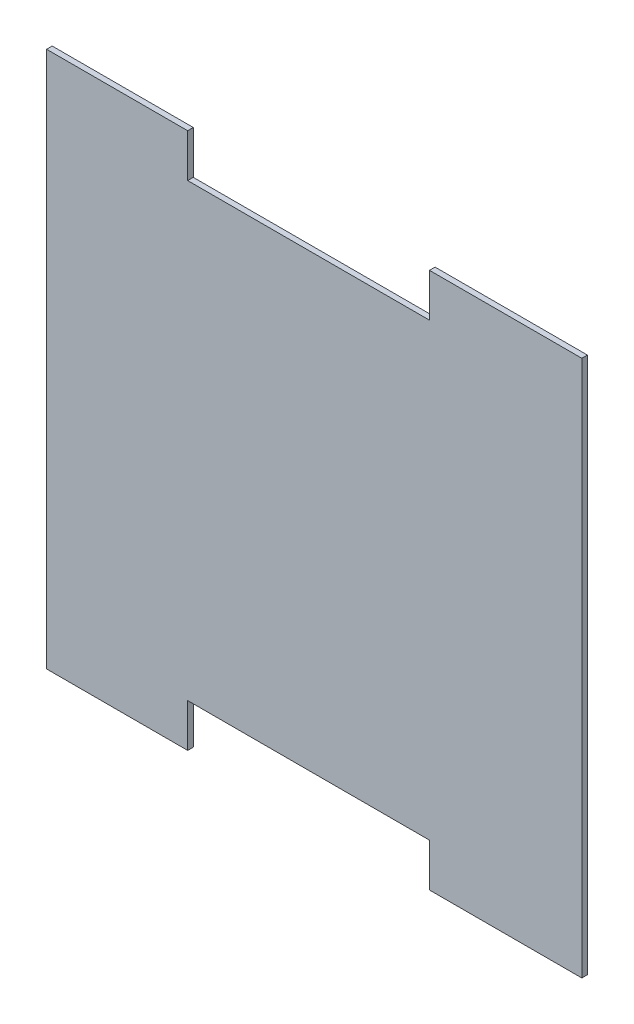
ISO-10303-21;
HEADER;
FILE_DESCRIPTION(('STEP AP214'),'2;1');
FILE_NAME('part.step','',(''),(''),'','','');
FILE_SCHEMA(('AUTOMOTIVE_DESIGN { 1 0 10303 214 1 1 1 1 }'));
ENDSEC;
DATA;
#1=APPLICATION_CONTEXT('core data for automotive mechanical design processes');
#2=APPLICATION_PROTOCOL_DEFINITION('international standard','automotive_design',2000,#1);
#3=PRODUCT_CONTEXT('',#1,'mechanical');
#4=PRODUCT('Part','Part','',(#3));
#5=PRODUCT_RELATED_PRODUCT_CATEGORY('part','',(#4));
#6=PRODUCT_DEFINITION_FORMATION('','',#4);
#7=PRODUCT_DEFINITION_CONTEXT('part definition',#1,'design');
#8=PRODUCT_DEFINITION('design','',#6,#7);
#9=PRODUCT_DEFINITION_SHAPE('','',#8);
#10=(LENGTH_UNIT() NAMED_UNIT(*) SI_UNIT(.MILLI.,.METRE.));
#11=(NAMED_UNIT(*) PLANE_ANGLE_UNIT() SI_UNIT($,.RADIAN.));
#12=(NAMED_UNIT(*) SI_UNIT($,.STERADIAN.) SOLID_ANGLE_UNIT());
#13=UNCERTAINTY_MEASURE_WITH_UNIT(LENGTH_MEASURE(1.E-05),#10,'distance_accuracy_value','');
#14=(GEOMETRIC_REPRESENTATION_CONTEXT(3) GLOBAL_UNCERTAINTY_ASSIGNED_CONTEXT((#13)) GLOBAL_UNIT_ASSIGNED_CONTEXT((#10,
#11,#12)) REPRESENTATION_CONTEXT('',''));
#15=CARTESIAN_POINT('',(0.,0.,0.));
#16=DIRECTION('',(0.,0.,1.));
#17=DIRECTION('',(1.,0.,0.));
#18=AXIS2_PLACEMENT_3D('',#15,#16,#17);
#19=CARTESIAN_POINT('',(91.1935362193029,7.28172159749589,82.554000008998));
#20=DIRECTION('',(0.,1.49998273706286E-09,1.));
#21=DIRECTION('',(1.,-2.26356526097615E-08,0.));
#22=AXIS2_PLACEMENT_3D('',#19,#20,#21);
#23=PLANE('',#22);
#24=DIRECTION('',(0.,1.,-1.49998273706286E-09));
#25=VECTOR('',#24,1.);
#26=CARTESIAN_POINT('',(115.59228328566,7.40872159749601,82.5540000088075));
#27=LINE('',#26,#25);
#28=CARTESIAN_POINT('',(115.59228328566,7.40872159749601,82.5540000088075));
#29=VERTEX_POINT('',#28);
#30=CARTESIAN_POINT('',(115.592283285659,31.7450216160829,82.5539999723035));
#31=VERTEX_POINT('',#30);
#32=EDGE_CURVE('E231',#29,#31,#27,.T.);
#33=ORIENTED_EDGE('',*,*,#32,.T.);
#34=DIRECTION('',(-1.,0.,0.));
#35=VECTOR('',#34,1.);
#36=CARTESIAN_POINT('',(115.592283285659,31.7450216160829,82.5539999723035));
#37=LINE('',#36,#35);
#38=CARTESIAN_POINT('',(108.68436270934,31.7450216160829,82.5539999723035));
#39=VERTEX_POINT('',#38);
#40=EDGE_CURVE('E27',#31,#39,#37,.T.);
#41=ORIENTED_EDGE('',*,*,#40,.T.);
#42=DIRECTION('',(0.,-1.,1.49998273706286E-09));
#43=VECTOR('',#42,1.);
#44=CARTESIAN_POINT('',(108.68436270934,31.7450216160829,82.5539999723035));
#45=LINE('',#44,#43);
#46=CARTESIAN_POINT('',(108.68436270934,29.7868429829044,82.5539999752407));
#47=VERTEX_POINT('',#46);
#48=EDGE_CURVE('E147',#39,#47,#45,.T.);
#49=ORIENTED_EDGE('',*,*,#48,.T.);
#50=DIRECTION('',(-1.,0.,0.));
#51=VECTOR('',#50,1.);
#52=CARTESIAN_POINT('',(108.68436270934,29.7868429829044,82.5539999752407));
#53=LINE('',#52,#51);
#54=CARTESIAN_POINT('',(97.72036271183,29.7868429829044,82.5539999752407));
#55=VERTEX_POINT('',#54);
#56=EDGE_CURVE('E175',#47,#55,#53,.T.);
#57=ORIENTED_EDGE('',*,*,#56,.T.);
#58=DIRECTION('',(0.,1.,-1.49998273706286E-09));
#59=VECTOR('',#58,1.);
#60=CARTESIAN_POINT('',(97.72036271183,29.7868429829044,82.5539999752407));
#61=LINE('',#60,#59);
#62=CARTESIAN_POINT('',(97.72036271183,31.7450216160828,82.5539999723035));
#63=VERTEX_POINT('',#62);
#64=EDGE_CURVE('E20',#55,#63,#61,.T.);
#65=ORIENTED_EDGE('',*,*,#64,.T.);
#66=DIRECTION('',(-1.,0.,0.));
#67=VECTOR('',#66,1.);
#68=CARTESIAN_POINT('',(97.72036271183,31.7450216160828,82.5539999723035));
#69=LINE('',#68,#67);
#70=CARTESIAN_POINT('',(91.3205362193029,31.7450216160828,82.5539999723035));
#71=VERTEX_POINT('',#70);
#72=EDGE_CURVE('E207',#63,#71,#69,.T.);
#73=ORIENTED_EDGE('',*,*,#72,.T.);
#74=DIRECTION('',(0.,-1.,1.49998273706286E-09));
#75=VECTOR('',#74,1.);
#76=CARTESIAN_POINT('',(91.3205362193029,31.7450216160828,82.5539999723035));
#77=LINE('',#76,#75);
#78=CARTESIAN_POINT('',(91.3205362193029,7.40872159749589,82.5540000088075));
#79=VERTEX_POINT('',#78);
#80=EDGE_CURVE('E195',#71,#79,#77,.T.);
#81=ORIENTED_EDGE('',*,*,#80,.T.);
#82=DIRECTION('',(1.,0.,0.));
#83=VECTOR('',#82,1.);
#84=CARTESIAN_POINT('',(91.3205362193029,7.40872159749589,82.5540000088075));
#85=LINE('',#84,#83);
#86=CARTESIAN_POINT('',(97.72036271183,7.4087215974959,82.5540000088075));
#87=VERTEX_POINT('',#86);
#88=EDGE_CURVE('E110',#79,#87,#85,.T.);
#89=ORIENTED_EDGE('',*,*,#88,.T.);
#90=DIRECTION('',(0.,1.,-1.49998273706286E-09));
#91=VECTOR('',#90,1.);
#92=CARTESIAN_POINT('',(97.72036271183,7.4087215974959,82.5540000088075));
#93=LINE('',#92,#91);
#94=CARTESIAN_POINT('',(97.72036271183,9.36690025308292,82.5540000058703));
#95=VERTEX_POINT('',#94);
#96=EDGE_CURVE('E215',#87,#95,#93,.T.);
#97=ORIENTED_EDGE('',*,*,#96,.T.);
#98=DIRECTION('',(1.,0.,0.));
#99=VECTOR('',#98,1.);
#100=CARTESIAN_POINT('',(97.72036271183,9.36690025308292,82.5540000058703));
#101=LINE('',#100,#99);
#102=CARTESIAN_POINT('',(108.684362677659,9.36690025308294,82.5540000058703));
#103=VERTEX_POINT('',#102);
#104=EDGE_CURVE('E104',#95,#103,#101,.T.);
#105=ORIENTED_EDGE('',*,*,#104,.T.);
#106=DIRECTION('',(0.,-1.,1.49998273706286E-09));
#107=VECTOR('',#106,1.);
#108=CARTESIAN_POINT('',(108.684362677659,9.36690025308294,82.5540000058703));
#109=LINE('',#108,#107);
#110=CARTESIAN_POINT('',(108.684362677659,7.408721597496,82.5540000088075));
#111=VERTEX_POINT('',#110);
#112=EDGE_CURVE('E200',#103,#111,#109,.T.);
#113=ORIENTED_EDGE('',*,*,#112,.T.);
#114=DIRECTION('',(1.,0.,0.));
#115=VECTOR('',#114,1.);
#116=CARTESIAN_POINT('',(108.684362677659,7.408721597496,82.5540000088075));
#117=LINE('',#116,#115);
#118=EDGE_CURVE('E220',#111,#29,#117,.T.);
#119=ORIENTED_EDGE('',*,*,#118,.T.);
#120=EDGE_LOOP('',(#33,#41,#49,#57,#65,#73,#81,#89,#97,#105,#113,#119));
#121=FACE_BOUND('',#120,.T.);
#122=ADVANCED_FACE('F16',(#121),#23,.T.);
#123=CARTESIAN_POINT('',(91.1935362193029,7.2817215971149,82.300000008998));
#124=DIRECTION('',(0.,1.49998273706286E-09,1.));
#125=DIRECTION('',(1.,-2.26356526097615E-08,0.));
#126=AXIS2_PLACEMENT_3D('',#123,#124,#125);
#127=PLANE('',#126);
#128=DIRECTION('',(0.,1.,-1.49998273706286E-09));
#129=VECTOR('',#128,1.);
#130=CARTESIAN_POINT('',(115.59228328566,7.40872159711502,82.3000000088075));
#131=LINE('',#130,#129);
#132=CARTESIAN_POINT('',(115.59228328566,7.40872159711502,82.3000000088075));
#133=VERTEX_POINT('',#132);
#134=CARTESIAN_POINT('',(115.592283285659,31.7450216157019,82.2999999723035));
#135=VERTEX_POINT('',#134);
#136=EDGE_CURVE('E221',#133,#135,#131,.T.);
#137=ORIENTED_EDGE('',*,*,#136,.F.);
#138=DIRECTION('',(1.,0.,0.));
#139=VECTOR('',#138,1.);
#140=CARTESIAN_POINT('',(108.684362677659,7.40872159711501,82.3000000088075));
#141=LINE('',#140,#139);
#142=CARTESIAN_POINT('',(108.684362677659,7.40872159711501,82.3000000088075));
#143=VERTEX_POINT('',#142);
#144=EDGE_CURVE('E196',#143,#133,#141,.T.);
#145=ORIENTED_EDGE('',*,*,#144,.F.);
#146=DIRECTION('',(0.,-1.,1.49998273706286E-09));
#147=VECTOR('',#146,1.);
#148=CARTESIAN_POINT('',(108.684362677659,9.36690025270194,82.3000000058703));
#149=LINE('',#148,#147);
#150=CARTESIAN_POINT('',(108.684362677659,9.36690025270194,82.3000000058703));
#151=VERTEX_POINT('',#150);
#152=EDGE_CURVE('E249',#151,#143,#149,.T.);
#153=ORIENTED_EDGE('',*,*,#152,.F.);
#154=DIRECTION('',(1.,0.,0.));
#155=VECTOR('',#154,1.);
#156=CARTESIAN_POINT('',(97.72036271183,9.36690025270192,82.3000000058703));
#157=LINE('',#156,#155);
#158=CARTESIAN_POINT('',(97.72036271183,9.36690025270192,82.3000000058703));
#159=VERTEX_POINT('',#158);
#160=EDGE_CURVE('E89',#159,#151,#157,.T.);
#161=ORIENTED_EDGE('',*,*,#160,.F.);
#162=DIRECTION('',(0.,1.,-1.49998273706286E-09));
#163=VECTOR('',#162,1.);
#164=CARTESIAN_POINT('',(97.72036271183,7.40872159711491,82.3000000088075));
#165=LINE('',#164,#163);
#166=CARTESIAN_POINT('',(97.72036271183,7.40872159711491,82.3000000088075));
#167=VERTEX_POINT('',#166);
#168=EDGE_CURVE('E122',#167,#159,#165,.T.);
#169=ORIENTED_EDGE('',*,*,#168,.F.);
#170=DIRECTION('',(1.,0.,0.));
#171=VECTOR('',#170,1.);
#172=CARTESIAN_POINT('',(91.3205362193029,7.4087215971149,82.3000000088075));
#173=LINE('',#172,#171);
#174=CARTESIAN_POINT('',(91.3205362193029,7.4087215971149,82.3000000088075));
#175=VERTEX_POINT('',#174);
#176=EDGE_CURVE('E189',#175,#167,#173,.T.);
#177=ORIENTED_EDGE('',*,*,#176,.F.);
#178=DIRECTION('',(0.,-1.,1.49998273706286E-09));
#179=VECTOR('',#178,1.);
#180=CARTESIAN_POINT('',(91.3205362193029,31.7450216157018,82.2999999723035));
#181=LINE('',#180,#179);
#182=CARTESIAN_POINT('',(91.3205362193029,31.7450216157018,82.2999999723035));
#183=VERTEX_POINT('',#182);
#184=EDGE_CURVE('E194',#183,#175,#181,.T.);
#185=ORIENTED_EDGE('',*,*,#184,.F.);
#186=DIRECTION('',(-1.,0.,0.));
#187=VECTOR('',#186,1.);
#188=CARTESIAN_POINT('',(97.72036271183,31.7450216157019,82.2999999723035));
#189=LINE('',#188,#187);
#190=CARTESIAN_POINT('',(97.72036271183,31.7450216157019,82.2999999723035));
#191=VERTEX_POINT('',#190);
#192=EDGE_CURVE('E206',#191,#183,#189,.T.);
#193=ORIENTED_EDGE('',*,*,#192,.F.);
#194=DIRECTION('',(0.,1.,-1.49998273706286E-09));
#195=VECTOR('',#194,1.);
#196=CARTESIAN_POINT('',(97.72036271183,29.7868429825234,82.2999999752407));
#197=LINE('',#196,#195);
#198=CARTESIAN_POINT('',(97.72036271183,29.7868429825234,82.2999999752407));
#199=VERTEX_POINT('',#198);
#200=EDGE_CURVE('E168',#199,#191,#197,.T.);
#201=ORIENTED_EDGE('',*,*,#200,.F.);
#202=DIRECTION('',(-1.,0.,0.));
#203=VECTOR('',#202,1.);
#204=CARTESIAN_POINT('',(108.68436270934,29.7868429825234,82.2999999752407));
#205=LINE('',#204,#203);
#206=CARTESIAN_POINT('',(108.68436270934,29.7868429825234,82.2999999752407));
#207=VERTEX_POINT('',#206);
#208=EDGE_CURVE('E164',#207,#199,#205,.T.);
#209=ORIENTED_EDGE('',*,*,#208,.F.);
#210=DIRECTION('',(0.,-1.,1.49998273706286E-09));
#211=VECTOR('',#210,1.);
#212=CARTESIAN_POINT('',(108.68436270934,31.7450216157019,82.2999999723035));
#213=LINE('',#212,#211);
#214=CARTESIAN_POINT('',(108.68436270934,31.7450216157019,82.2999999723035));
#215=VERTEX_POINT('',#214);
#216=EDGE_CURVE('E153',#215,#207,#213,.T.);
#217=ORIENTED_EDGE('',*,*,#216,.F.);
#218=DIRECTION('',(-1.,0.,0.));
#219=VECTOR('',#218,1.);
#220=CARTESIAN_POINT('',(115.592283285659,31.7450216157019,82.2999999723035));
#221=LINE('',#220,#219);
#222=EDGE_CURVE('E10',#135,#215,#221,.T.);
#223=ORIENTED_EDGE('',*,*,#222,.F.);
#224=EDGE_LOOP('',(#137,#145,#153,#161,#169,#177,#185,#193,#201,#209,#217,#223));
#225=FACE_BOUND('',#224,.T.);
#226=ADVANCED_FACE('F166',(#225),#127,.F.);
#227=CARTESIAN_POINT('',(115.592283285659,31.7450216157019,82.2999999723035));
#228=DIRECTION('',(0.,1.,-1.49998273706286E-09));
#229=DIRECTION('',(-0.999999999999444,0.,1.05472401188537E-06));
#230=AXIS2_PLACEMENT_3D('',#227,#228,#229);
#231=PLANE('',#230);
#232=ORIENTED_EDGE('',*,*,#40,.F.);
#233=DIRECTION('',(0.,1.49998273706286E-09,1.));
#234=VECTOR('',#233,1.);
#235=CARTESIAN_POINT('',(115.592283285659,31.7450216157019,82.2999999723035));
#236=LINE('',#235,#234);
#237=EDGE_CURVE('E216',#135,#31,#236,.T.);
#238=ORIENTED_EDGE('',*,*,#237,.F.);
#239=ORIENTED_EDGE('',*,*,#222,.T.);
#240=DIRECTION('',(0.,1.49998273706286E-09,1.));
#241=VECTOR('',#240,1.);
#242=CARTESIAN_POINT('',(108.68436270934,31.7450216157019,82.2999999723035));
#243=LINE('',#242,#241);
#244=EDGE_CURVE('E159',#215,#39,#243,.T.);
#245=ORIENTED_EDGE('',*,*,#244,.T.);
#246=EDGE_LOOP('',(#232,#238,#239,#245));
#247=FACE_BOUND('',#246,.T.);
#248=ADVANCED_FACE('F264',(#247),#231,.T.);
#249=CARTESIAN_POINT('',(108.68436270934,31.7450216157019,82.2999999723035));
#250=DIRECTION('',(-1.,0.,0.));
#251=DIRECTION('',(0.,1.,0.));
#252=AXIS2_PLACEMENT_3D('',#249,#250,#251);
#253=PLANE('',#252);
#254=ORIENTED_EDGE('',*,*,#48,.F.);
#255=ORIENTED_EDGE('',*,*,#244,.F.);
#256=ORIENTED_EDGE('',*,*,#216,.T.);
#257=DIRECTION('',(0.,1.49998273706286E-09,1.));
#258=VECTOR('',#257,1.);
#259=CARTESIAN_POINT('',(108.68436270934,29.7868429825234,82.2999999752407));
#260=LINE('',#259,#258);
#261=EDGE_CURVE('E157',#207,#47,#260,.T.);
#262=ORIENTED_EDGE('',*,*,#261,.T.);
#263=EDGE_LOOP('',(#254,#255,#256,#262));
#264=FACE_BOUND('',#263,.T.);
#265=ADVANCED_FACE('F155',(#264),#253,.T.);
#266=CARTESIAN_POINT('',(108.68436270934,29.7868429825234,82.2999999752407));
#267=DIRECTION('',(0.,1.,-1.49998273706286E-09));
#268=DIRECTION('',(-0.999999999999444,0.,1.05472401188537E-06));
#269=AXIS2_PLACEMENT_3D('',#266,#267,#268);
#270=PLANE('',#269);
#271=ORIENTED_EDGE('',*,*,#56,.F.);
#272=ORIENTED_EDGE('',*,*,#261,.F.);
#273=ORIENTED_EDGE('',*,*,#208,.T.);
#274=DIRECTION('',(0.,1.49998273706286E-09,1.));
#275=VECTOR('',#274,1.);
#276=CARTESIAN_POINT('',(97.72036271183,29.7868429825234,82.2999999752407));
#277=LINE('',#276,#275);
#278=EDGE_CURVE('E224',#199,#55,#277,.T.);
#279=ORIENTED_EDGE('',*,*,#278,.T.);
#280=EDGE_LOOP('',(#271,#272,#273,#279));
#281=FACE_BOUND('',#280,.T.);
#282=ADVANCED_FACE('F174',(#281),#270,.T.);
#283=CARTESIAN_POINT('',(97.72036271183,29.7868429825234,82.2999999752407));
#284=DIRECTION('',(1.,0.,0.));
#285=DIRECTION('',(0.,1.,0.));
#286=AXIS2_PLACEMENT_3D('',#283,#284,#285);
#287=PLANE('',#286);
#288=ORIENTED_EDGE('',*,*,#64,.F.);
#289=ORIENTED_EDGE('',*,*,#278,.F.);
#290=ORIENTED_EDGE('',*,*,#200,.T.);
#291=DIRECTION('',(0.,1.49998273706286E-09,1.));
#292=VECTOR('',#291,1.);
#293=CARTESIAN_POINT('',(97.72036271183,31.7450216157019,82.2999999723035));
#294=LINE('',#293,#292);
#295=EDGE_CURVE('E202',#191,#63,#294,.T.);
#296=ORIENTED_EDGE('',*,*,#295,.T.);
#297=EDGE_LOOP('',(#288,#289,#290,#296));
#298=FACE_BOUND('',#297,.T.);
#299=ADVANCED_FACE('F296',(#298),#287,.T.);
#300=CARTESIAN_POINT('',(97.72036271183,31.7450216157019,82.2999999723035));
#301=DIRECTION('',(0.,1.,-1.49998273706286E-09));
#302=DIRECTION('',(-0.999999999999444,0.,1.05472401188537E-06));
#303=AXIS2_PLACEMENT_3D('',#300,#301,#302);
#304=PLANE('',#303);
#305=ORIENTED_EDGE('',*,*,#72,.F.);
#306=ORIENTED_EDGE('',*,*,#295,.F.);
#307=ORIENTED_EDGE('',*,*,#192,.T.);
#308=DIRECTION('',(0.,1.49998273706286E-09,1.));
#309=VECTOR('',#308,1.);
#310=CARTESIAN_POINT('',(91.3205362193029,31.7450216157018,82.2999999723035));
#311=LINE('',#310,#309);
#312=EDGE_CURVE('E190',#183,#71,#311,.T.);
#313=ORIENTED_EDGE('',*,*,#312,.T.);
#314=EDGE_LOOP('',(#305,#306,#307,#313));
#315=FACE_BOUND('',#314,.T.);
#316=ADVANCED_FACE('F298',(#315),#304,.T.);
#317=CARTESIAN_POINT('',(91.3205362193029,31.7450216157018,82.2999999723035));
#318=DIRECTION('',(-1.,0.,0.));
#319=DIRECTION('',(0.,1.,0.));
#320=AXIS2_PLACEMENT_3D('',#317,#318,#319);
#321=PLANE('',#320);
#322=ORIENTED_EDGE('',*,*,#80,.F.);
#323=ORIENTED_EDGE('',*,*,#312,.F.);
#324=ORIENTED_EDGE('',*,*,#184,.T.);
#325=DIRECTION('',(0.,1.49998273706286E-09,1.));
#326=VECTOR('',#325,1.);
#327=CARTESIAN_POINT('',(91.3205362193029,7.4087215971149,82.3000000088075));
#328=LINE('',#327,#326);
#329=EDGE_CURVE('E186',#175,#79,#328,.T.);
#330=ORIENTED_EDGE('',*,*,#329,.T.);
#331=EDGE_LOOP('',(#322,#323,#324,#330));
#332=FACE_BOUND('',#331,.T.);
#333=ADVANCED_FACE('F18',(#332),#321,.T.);
#334=CARTESIAN_POINT('',(91.3205362193029,7.4087215971149,82.3000000088075));
#335=DIRECTION('',(0.,-1.,1.49998273706286E-09));
#336=DIRECTION('',(-1.,0.,0.));
#337=AXIS2_PLACEMENT_3D('',#334,#335,#336);
#338=PLANE('',#337);
#339=ORIENTED_EDGE('',*,*,#88,.F.);
#340=ORIENTED_EDGE('',*,*,#329,.F.);
#341=ORIENTED_EDGE('',*,*,#176,.T.);
#342=DIRECTION('',(0.,1.49998273706286E-09,1.));
#343=VECTOR('',#342,1.);
#344=CARTESIAN_POINT('',(97.72036271183,7.40872159711491,82.3000000088075));
#345=LINE('',#344,#343);
#346=EDGE_CURVE('E212',#167,#87,#345,.T.);
#347=ORIENTED_EDGE('',*,*,#346,.T.);
#348=EDGE_LOOP('',(#339,#340,#341,#347));
#349=FACE_BOUND('',#348,.T.);
#350=ADVANCED_FACE('F311',(#349),#338,.T.);
#351=CARTESIAN_POINT('',(97.72036271183,7.40872159711491,82.3000000088075));
#352=DIRECTION('',(1.,0.,0.));
#353=DIRECTION('',(0.,1.,0.));
#354=AXIS2_PLACEMENT_3D('',#351,#352,#353);
#355=PLANE('',#354);
#356=ORIENTED_EDGE('',*,*,#96,.F.);
#357=ORIENTED_EDGE('',*,*,#346,.F.);
#358=ORIENTED_EDGE('',*,*,#168,.T.);
#359=DIRECTION('',(0.,1.49998273706286E-09,1.));
#360=VECTOR('',#359,1.);
#361=CARTESIAN_POINT('',(97.72036271183,9.36690025270192,82.3000000058703));
#362=LINE('',#361,#360);
#363=EDGE_CURVE('E239',#159,#95,#362,.T.);
#364=ORIENTED_EDGE('',*,*,#363,.T.);
#365=EDGE_LOOP('',(#356,#357,#358,#364));
#366=FACE_BOUND('',#365,.T.);
#367=ADVANCED_FACE('F313',(#366),#355,.T.);
#368=CARTESIAN_POINT('',(97.72036271183,9.36690025270192,82.3000000058703));
#369=DIRECTION('',(0.,-1.,1.49998273706286E-09));
#370=DIRECTION('',(-1.,0.,0.));
#371=AXIS2_PLACEMENT_3D('',#368,#369,#370);
#372=PLANE('',#371);
#373=ORIENTED_EDGE('',*,*,#104,.F.);
#374=ORIENTED_EDGE('',*,*,#363,.F.);
#375=ORIENTED_EDGE('',*,*,#160,.T.);
#376=DIRECTION('',(0.,1.49998273706286E-09,1.));
#377=VECTOR('',#376,1.);
#378=CARTESIAN_POINT('',(108.684362677659,9.36690025270194,82.3000000058703));
#379=LINE('',#378,#377);
#380=EDGE_CURVE('E243',#151,#103,#379,.T.);
#381=ORIENTED_EDGE('',*,*,#380,.T.);
#382=EDGE_LOOP('',(#373,#374,#375,#381));
#383=FACE_BOUND('',#382,.T.);
#384=ADVANCED_FACE('F314',(#383),#372,.T.);
#385=CARTESIAN_POINT('',(108.684362677659,9.36690025270194,82.3000000058703));
#386=DIRECTION('',(-1.,0.,0.));
#387=DIRECTION('',(0.,1.,0.));
#388=AXIS2_PLACEMENT_3D('',#385,#386,#387);
#389=PLANE('',#388);
#390=ORIENTED_EDGE('',*,*,#112,.F.);
#391=ORIENTED_EDGE('',*,*,#380,.F.);
#392=ORIENTED_EDGE('',*,*,#152,.T.);
#393=DIRECTION('',(0.,1.49998273706286E-09,1.));
#394=VECTOR('',#393,1.);
#395=CARTESIAN_POINT('',(108.684362677659,7.40872159711501,82.3000000088075));
#396=LINE('',#395,#394);
#397=EDGE_CURVE('E201',#143,#111,#396,.T.);
#398=ORIENTED_EDGE('',*,*,#397,.T.);
#399=EDGE_LOOP('',(#390,#391,#392,#398));
#400=FACE_BOUND('',#399,.T.);
#401=ADVANCED_FACE('F281',(#400),#389,.T.);
#402=CARTESIAN_POINT('',(108.684362677659,7.40872159711501,82.3000000088075));
#403=DIRECTION('',(0.,-1.,1.49998273706286E-09));
#404=DIRECTION('',(-1.,0.,0.));
#405=AXIS2_PLACEMENT_3D('',#402,#403,#404);
#406=PLANE('',#405);
#407=ORIENTED_EDGE('',*,*,#118,.F.);
#408=ORIENTED_EDGE('',*,*,#397,.F.);
#409=ORIENTED_EDGE('',*,*,#144,.T.);
#410=DIRECTION('',(0.,1.49998273706286E-09,1.));
#411=VECTOR('',#410,1.);
#412=CARTESIAN_POINT('',(115.59228328566,7.40872159711502,82.3000000088075));
#413=LINE('',#412,#411);
#414=EDGE_CURVE('E227',#133,#29,#413,.T.);
#415=ORIENTED_EDGE('',*,*,#414,.T.);
#416=EDGE_LOOP('',(#407,#408,#409,#415));
#417=FACE_BOUND('',#416,.T.);
#418=ADVANCED_FACE('F273',(#417),#406,.T.);
#419=CARTESIAN_POINT('',(115.59228328566,7.40872159711502,82.3000000088075));
#420=DIRECTION('',(1.,0.,0.));
#421=DIRECTION('',(0.,1.,0.));
#422=AXIS2_PLACEMENT_3D('',#419,#420,#421);
#423=PLANE('',#422);
#424=ORIENTED_EDGE('',*,*,#32,.F.);
#425=ORIENTED_EDGE('',*,*,#414,.F.);
#426=ORIENTED_EDGE('',*,*,#136,.T.);
#427=ORIENTED_EDGE('',*,*,#237,.T.);
#428=EDGE_LOOP('',(#424,#425,#426,#427));
#429=FACE_BOUND('',#428,.T.);
#430=ADVANCED_FACE('F267',(#429),#423,.T.);
#431=CLOSED_SHELL('',(#122,#226,#248,#265,#282,#299,#316,#333,#350,#367,#384,#401,#418,#430));
#432=MANIFOLD_SOLID_BREP('B1',#431);
#433=ADVANCED_BREP_SHAPE_REPRESENTATION('',(#18,#432),#14);
#434=SHAPE_DEFINITION_REPRESENTATION(#9,#433);
ENDSEC;
END-ISO-10303-21;
